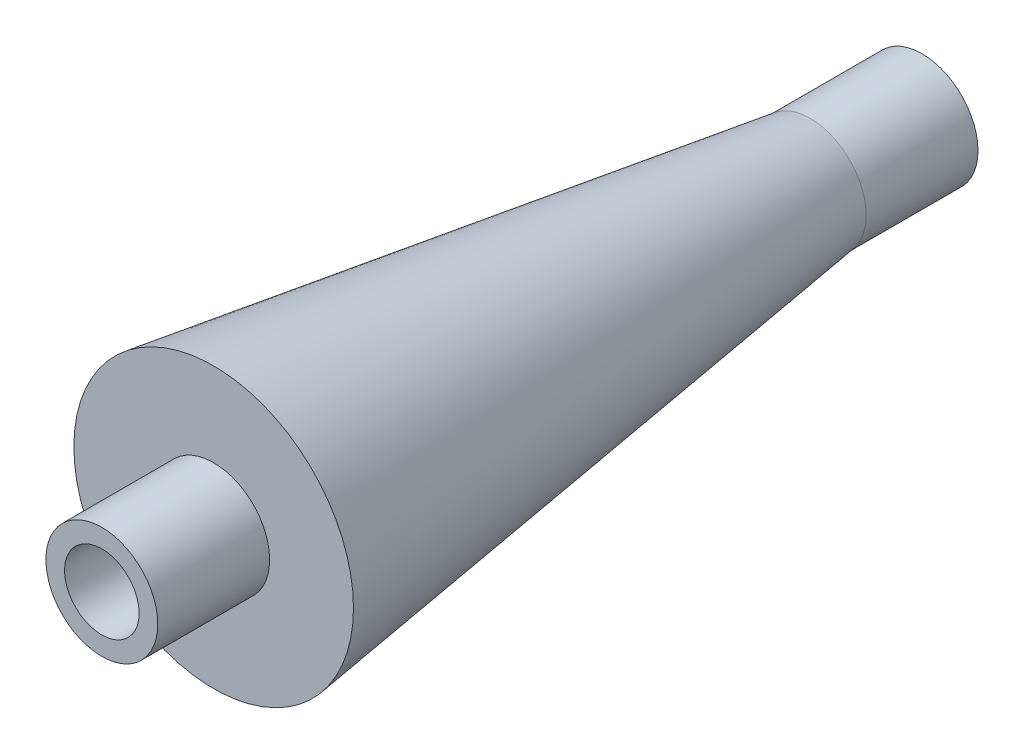
ISO-10303-21;
HEADER;
FILE_DESCRIPTION(('STEP AP214'),'2;1');
FILE_NAME('part.step','',(''),(''),'','','');
FILE_SCHEMA(('AUTOMOTIVE_DESIGN { 1 0 10303 214 1 1 1 1 }'));
ENDSEC;
DATA;
#1=APPLICATION_CONTEXT('core data for automotive mechanical design processes');
#2=APPLICATION_PROTOCOL_DEFINITION('international standard','automotive_design',2000,#1);
#3=PRODUCT_CONTEXT('',#1,'mechanical');
#4=PRODUCT('Part','Part','',(#3));
#5=PRODUCT_RELATED_PRODUCT_CATEGORY('part','',(#4));
#6=PRODUCT_DEFINITION_FORMATION('','',#4);
#7=PRODUCT_DEFINITION_CONTEXT('part definition',#1,'design');
#8=PRODUCT_DEFINITION('design','',#6,#7);
#9=PRODUCT_DEFINITION_SHAPE('','',#8);
#10=(LENGTH_UNIT() NAMED_UNIT(*) SI_UNIT(.MILLI.,.METRE.));
#11=(NAMED_UNIT(*) PLANE_ANGLE_UNIT() SI_UNIT($,.RADIAN.));
#12=(NAMED_UNIT(*) SI_UNIT($,.STERADIAN.) SOLID_ANGLE_UNIT());
#13=UNCERTAINTY_MEASURE_WITH_UNIT(LENGTH_MEASURE(1.E-05),#10,'distance_accuracy_value','');
#14=(GEOMETRIC_REPRESENTATION_CONTEXT(3) GLOBAL_UNCERTAINTY_ASSIGNED_CONTEXT((#13)) GLOBAL_UNIT_ASSIGNED_CONTEXT((#10,
#11,#12)) REPRESENTATION_CONTEXT('',''));
#15=CARTESIAN_POINT('',(0.,0.,0.));
#16=DIRECTION('',(0.,0.,1.));
#17=DIRECTION('',(1.,0.,0.));
#18=AXIS2_PLACEMENT_3D('',#15,#16,#17);
#19=CARTESIAN_POINT('',(0.,0.,1.5875));
#20=DIRECTION('',(0.,0.,1.));
#21=DIRECTION('',(1.,0.,0.));
#22=AXIS2_PLACEMENT_3D('',#19,#20,#21);
#23=CYLINDRICAL_SURFACE('',#22,3.175);
#24=CARTESIAN_POINT('',(0.,0.,-84.2932995720377));
#25=DIRECTION('',(0.,0.,1.));
#26=DIRECTION('',(1.,0.,0.));
#27=AXIS2_PLACEMENT_3D('',#24,#25,#26);
#28=CIRCLE('',#27,3.175);
#29=CARTESIAN_POINT('',(3.175,0.,-84.2932995720377));
#30=VERTEX_POINT('',#29);
#31=EDGE_CURVE('E68',#30,#30,#28,.T.);
#32=ORIENTED_EDGE('',*,*,#31,.F.);
#33=EDGE_LOOP('',(#32));
#34=FACE_BOUND('',#33,.T.);
#35=CARTESIAN_POINT('',(0.,0.,-14.4432995720377));
#36=DIRECTION('',(0.,0.,1.));
#37=DIRECTION('',(1.,0.,0.));
#38=AXIS2_PLACEMENT_3D('',#35,#36,#37);
#39=CIRCLE('',#38,3.175);
#40=CARTESIAN_POINT('',(3.175,0.,-14.4432995720377));
#41=VERTEX_POINT('',#40);
#42=EDGE_CURVE('E12',#41,#41,#39,.T.);
#43=ORIENTED_EDGE('',*,*,#42,.T.);
#44=EDGE_LOOP('',(#43));
#45=FACE_BOUND('',#44,.T.);
#46=ADVANCED_FACE('F43',(#34,#45),#23,.F.);
#47=CARTESIAN_POINT('',(0.,0.,-14.4432995720377));
#48=DIRECTION('',(0.,0.,-1.));
#49=DIRECTION('',(-1.,0.,0.));
#50=AXIS2_PLACEMENT_3D('',#47,#48,#49);
#51=PLANE('',#50);
#52=ORIENTED_EDGE('',*,*,#42,.F.);
#53=EDGE_LOOP('',(#52));
#54=FACE_BOUND('',#53,.T.);
#55=CARTESIAN_POINT('',(0.,0.,-14.4432995720377));
#56=DIRECTION('',(0.,0.,1.));
#57=DIRECTION('',(1.,0.,0.));
#58=AXIS2_PLACEMENT_3D('',#55,#56,#57);
#59=CIRCLE('',#58,4.76250000000002);
#60=CARTESIAN_POINT('',(4.76250000000002,0.,-14.4432995720377));
#61=VERTEX_POINT('',#60);
#62=EDGE_CURVE('E49',#61,#61,#59,.T.);
#63=ORIENTED_EDGE('',*,*,#62,.T.);
#64=EDGE_LOOP('',(#63));
#65=FACE_BOUND('',#64,.T.);
#66=ADVANCED_FACE('F76',(#54,#65),#51,.F.);
#67=CARTESIAN_POINT('',(0.,0.,1.5875));
#68=DIRECTION('',(0.,0.,1.));
#69=DIRECTION('',(1.,0.,0.));
#70=AXIS2_PLACEMENT_3D('',#67,#68,#69);
#71=CYLINDRICAL_SURFACE('',#70,4.76250000000001);
#72=ORIENTED_EDGE('',*,*,#62,.F.);
#73=EDGE_LOOP('',(#72));
#74=FACE_BOUND('',#73,.T.);
#75=CARTESIAN_POINT('',(0.,0.,-23.9682995720377));
#76=DIRECTION('',(0.,0.,1.));
#77=DIRECTION('',(1.,0.,0.));
#78=AXIS2_PLACEMENT_3D('',#75,#76,#77);
#79=CIRCLE('',#78,4.7625);
#80=CARTESIAN_POINT('',(4.7625,0.,-23.9682995720377));
#81=VERTEX_POINT('',#80);
#82=EDGE_CURVE('E53',#81,#81,#79,.T.);
#83=ORIENTED_EDGE('',*,*,#82,.T.);
#84=EDGE_LOOP('',(#83));
#85=FACE_BOUND('',#84,.T.);
#86=ADVANCED_FACE('F80',(#74,#85),#71,.T.);
#87=CARTESIAN_POINT('',(0.,0.,-23.9682995720377));
#88=DIRECTION('',(0.,0.,-1.));
#89=DIRECTION('',(-1.,0.,0.));
#90=AXIS2_PLACEMENT_3D('',#87,#88,#89);
#91=PLANE('',#90);
#92=ORIENTED_EDGE('',*,*,#82,.F.);
#93=EDGE_LOOP('',(#92));
#94=FACE_BOUND('',#93,.T.);
#95=CARTESIAN_POINT('',(0.,0.,-23.9682995720377));
#96=DIRECTION('',(0.,0.,1.));
#97=DIRECTION('',(1.,0.,0.));
#98=AXIS2_PLACEMENT_3D('',#95,#96,#97);
#99=CIRCLE('',#98,11.90625);
#100=CARTESIAN_POINT('',(11.90625,0.,-23.9682995720377));
#101=VERTEX_POINT('',#100);
#102=EDGE_CURVE('E57',#101,#101,#99,.T.);
#103=ORIENTED_EDGE('',*,*,#102,.T.);
#104=EDGE_LOOP('',(#103));
#105=FACE_BOUND('',#104,.T.);
#106=ADVANCED_FACE('F85',(#94,#105),#91,.F.);
#107=CARTESIAN_POINT('',(0.,0.,-74.7682995720377));
#108=DIRECTION('',(0.,0.,1.));
#109=DIRECTION('',(1.,0.,0.));
#110=AXIS2_PLACEMENT_3D('',#107,#108,#109);
#111=CONICAL_SURFACE('',#110,4.7625,0.139708874289164);
#112=ORIENTED_EDGE('',*,*,#102,.F.);
#113=EDGE_LOOP('',(#112));
#114=FACE_BOUND('',#113,.T.);
#115=CARTESIAN_POINT('',(0.,0.,-74.7682995720377));
#116=DIRECTION('',(0.,0.,1.));
#117=DIRECTION('',(1.,0.,0.));
#118=AXIS2_PLACEMENT_3D('',#115,#116,#117);
#119=CIRCLE('',#118,4.7625);
#120=CARTESIAN_POINT('',(4.7625,0.,-74.7682995720377));
#121=VERTEX_POINT('',#120);
#122=EDGE_CURVE('E62',#121,#121,#119,.T.);
#123=ORIENTED_EDGE('',*,*,#122,.T.);
#124=EDGE_LOOP('',(#123));
#125=FACE_BOUND('',#124,.T.);
#126=ADVANCED_FACE('F91',(#114,#125),#111,.T.);
#127=CARTESIAN_POINT('',(0.,0.,1.5875));
#128=DIRECTION('',(0.,0.,1.));
#129=DIRECTION('',(1.,0.,0.));
#130=AXIS2_PLACEMENT_3D('',#127,#128,#129);
#131=CYLINDRICAL_SURFACE('',#130,4.7625);
#132=CARTESIAN_POINT('',(0.,0.,-84.2932995720377));
#133=DIRECTION('',(0.,0.,1.));
#134=DIRECTION('',(1.,0.,0.));
#135=AXIS2_PLACEMENT_3D('',#132,#133,#134);
#136=CIRCLE('',#135,4.7625);
#137=CARTESIAN_POINT('',(4.7625,0.,-84.2932995720377));
#138=VERTEX_POINT('',#137);
#139=EDGE_CURVE('E65',#138,#138,#136,.T.);
#140=ORIENTED_EDGE('',*,*,#139,.T.);
#141=EDGE_LOOP('',(#140));
#142=FACE_BOUND('',#141,.T.);
#143=ORIENTED_EDGE('',*,*,#122,.F.);
#144=EDGE_LOOP('',(#143));
#145=FACE_BOUND('',#144,.T.);
#146=ADVANCED_FACE('F95',(#142,#145),#131,.T.);
#147=CARTESIAN_POINT('',(0.,0.,-84.2932995720377));
#148=DIRECTION('',(0.,0.,-1.));
#149=DIRECTION('',(-1.,0.,0.));
#150=AXIS2_PLACEMENT_3D('',#147,#148,#149);
#151=PLANE('',#150);
#152=ORIENTED_EDGE('',*,*,#31,.T.);
#153=EDGE_LOOP('',(#152));
#154=FACE_BOUND('',#153,.T.);
#155=ORIENTED_EDGE('',*,*,#139,.F.);
#156=EDGE_LOOP('',(#155));
#157=FACE_BOUND('',#156,.T.);
#158=ADVANCED_FACE('F72',(#154,#157),#151,.T.);
#159=CLOSED_SHELL('',(#46,#66,#86,#106,#126,#146,#158));
#160=MANIFOLD_SOLID_BREP('B2',#159);
#161=ADVANCED_BREP_SHAPE_REPRESENTATION('',(#18,#160),#14);
#162=SHAPE_DEFINITION_REPRESENTATION(#9,#161);
ENDSEC;
END-ISO-10303-21;
